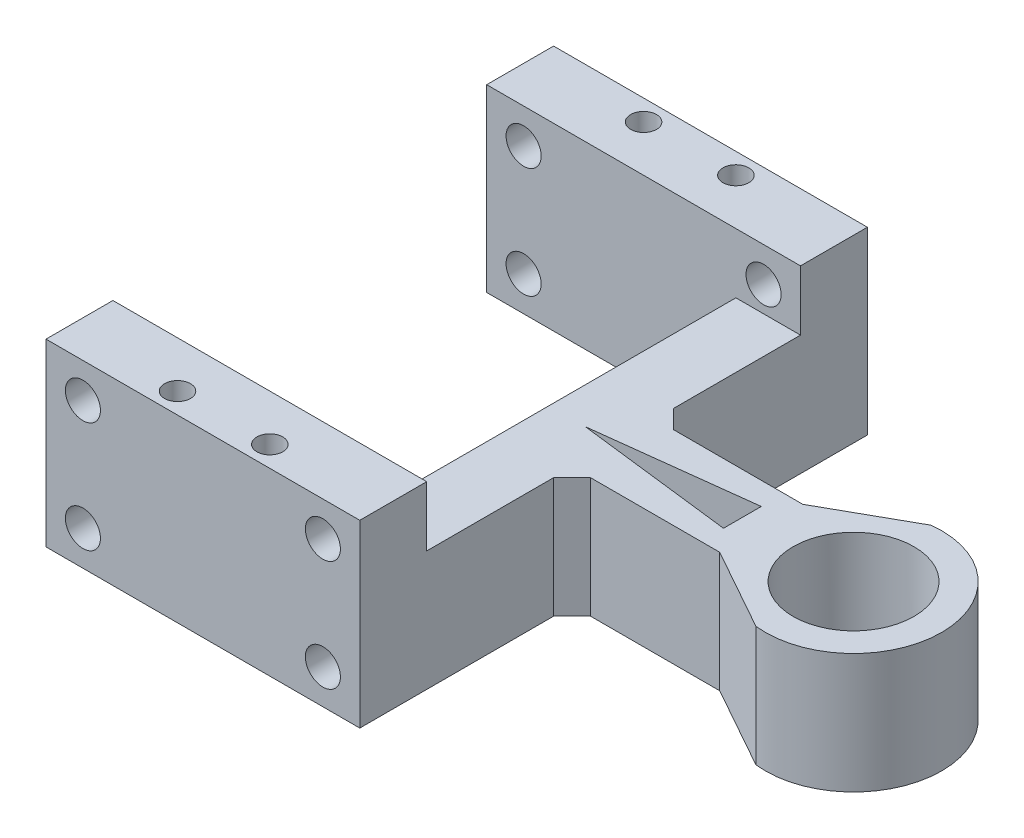
ISO-10303-21;
HEADER;
FILE_DESCRIPTION(('STEP AP214'),'2;1');
FILE_NAME('part.step','',(''),(''),'','','');
FILE_SCHEMA(('AUTOMOTIVE_DESIGN { 1 0 10303 214 1 1 1 1 }'));
ENDSEC;
DATA;
#1=APPLICATION_CONTEXT('core data for automotive mechanical design processes');
#2=APPLICATION_PROTOCOL_DEFINITION('international standard','automotive_design',2000,#1);
#3=PRODUCT_CONTEXT('',#1,'mechanical');
#4=PRODUCT('Part','Part','',(#3));
#5=PRODUCT_RELATED_PRODUCT_CATEGORY('part','',(#4));
#6=PRODUCT_DEFINITION_FORMATION('','',#4);
#7=PRODUCT_DEFINITION_CONTEXT('part definition',#1,'design');
#8=PRODUCT_DEFINITION('design','',#6,#7);
#9=PRODUCT_DEFINITION_SHAPE('','',#8);
#10=(LENGTH_UNIT() NAMED_UNIT(*) SI_UNIT(.MILLI.,.METRE.));
#11=(NAMED_UNIT(*) PLANE_ANGLE_UNIT() SI_UNIT($,.RADIAN.));
#12=(NAMED_UNIT(*) SI_UNIT($,.STERADIAN.) SOLID_ANGLE_UNIT());
#13=UNCERTAINTY_MEASURE_WITH_UNIT(LENGTH_MEASURE(1.E-05),#10,'distance_accuracy_value','');
#14=(GEOMETRIC_REPRESENTATION_CONTEXT(3) GLOBAL_UNCERTAINTY_ASSIGNED_CONTEXT((#13)) GLOBAL_UNIT_ASSIGNED_CONTEXT((#10,
#11,#12)) REPRESENTATION_CONTEXT('',''));
#15=CARTESIAN_POINT('',(0.,0.,0.));
#16=DIRECTION('',(0.,0.,1.));
#17=DIRECTION('',(1.,0.,0.));
#18=AXIS2_PLACEMENT_3D('',#15,#16,#17);
#19=CARTESIAN_POINT('',(0.,0.,0.));
#20=DIRECTION('',(0.,1.,0.));
#21=DIRECTION('',(0.,0.,1.));
#22=AXIS2_PLACEMENT_3D('',#19,#20,#21);
#23=PLANE('',#22);
#24=CARTESIAN_POINT('',(12.,0.,25.25));
#25=DIRECTION('',(0.,1.,0.));
#26=DIRECTION('',(0.,0.,1.));
#27=AXIS2_PLACEMENT_3D('',#24,#25,#26);
#28=CIRCLE('',#27,1.4);
#29=CARTESIAN_POINT('',(12.,0.,26.65));
#30=VERTEX_POINT('',#29);
#31=EDGE_CURVE('E295',#30,#30,#28,.F.);
#32=ORIENTED_EDGE('',*,*,#31,.F.);
#33=EDGE_LOOP('',(#32));
#34=FACE_BOUND('',#33,.T.);
#35=DIRECTION('',(0.872552456288077,0.,0.488520430509967));
#36=VECTOR('',#35,1.);
#37=CARTESIAN_POINT('',(10.0144418941344,0.,-17.8869200290344));
#38=LINE('',#37,#36);
#39=CARTESIAN_POINT('',(50.,0.,4.5));
#40=VERTEX_POINT('',#39);
#41=CARTESIAN_POINT('',(58.9079868315247,0.,9.48736039369625));
#42=VERTEX_POINT('',#41);
#43=EDGE_CURVE('E334',#40,#42,#38,.T.);
#44=ORIENTED_EDGE('',*,*,#43,.F.);
#45=DIRECTION('',(1.,0.,0.));
#46=VECTOR('',#45,1.);
#47=CARTESIAN_POINT('',(0.,0.,4.5));
#48=LINE('',#47,#46);
#49=CARTESIAN_POINT('',(36.,0.,4.5));
#50=VERTEX_POINT('',#49);
#51=EDGE_CURVE('E367',#50,#40,#48,.T.);
#52=ORIENTED_EDGE('',*,*,#51,.F.);
#53=DIRECTION('',(0.707106781186552,0.,-0.707106781186543));
#54=VECTOR('',#53,1.);
#55=CARTESIAN_POINT('',(20.2499999999998,0.,20.25));
#56=LINE('',#55,#54);
#57=CARTESIAN_POINT('',(34.,0.,6.49999999999999));
#58=VERTEX_POINT('',#57);
#59=EDGE_CURVE('E427',#50,#58,#56,.F.);
#60=ORIENTED_EDGE('',*,*,#59,.T.);
#61=DIRECTION('',(0.,0.,-1.));
#62=VECTOR('',#61,1.);
#63=CARTESIAN_POINT('',(34.,0.,0.));
#64=LINE('',#63,#62);
#65=CARTESIAN_POINT('',(34.,0.,27.5));
#66=VERTEX_POINT('',#65);
#67=EDGE_CURVE('E364',#66,#58,#64,.T.);
#68=ORIENTED_EDGE('',*,*,#67,.F.);
#69=DIRECTION('',(1.,0.,0.));
#70=VECTOR('',#69,1.);
#71=CARTESIAN_POINT('',(0.,0.,27.5));
#72=LINE('',#71,#70);
#73=CARTESIAN_POINT('',(0.,0.,27.5));
#74=VERTEX_POINT('',#73);
#75=EDGE_CURVE('E362',#74,#66,#72,.T.);
#76=ORIENTED_EDGE('',*,*,#75,.F.);
#77=DIRECTION('',(0.,0.,1.));
#78=VECTOR('',#77,1.);
#79=CARTESIAN_POINT('',(0.,0.,0.));
#80=LINE('',#79,#78);
#81=CARTESIAN_POINT('',(0.,0.,20.25));
#82=VERTEX_POINT('',#81);
#83=EDGE_CURVE('E360',#82,#74,#80,.T.);
#84=ORIENTED_EDGE('',*,*,#83,.F.);
#85=DIRECTION('',(1.,0.,0.));
#86=VECTOR('',#85,1.);
#87=CARTESIAN_POINT('',(0.,0.,20.25));
#88=LINE('',#87,#86);
#89=CARTESIAN_POINT('',(27.,0.,20.25));
#90=VERTEX_POINT('',#89);
#91=EDGE_CURVE('E357',#82,#90,#88,.T.);
#92=ORIENTED_EDGE('',*,*,#91,.T.);
#93=DIRECTION('',(0.,0.,1.));
#94=VECTOR('',#93,1.);
#95=CARTESIAN_POINT('',(27.,0.,0.));
#96=LINE('',#95,#94);
#97=CARTESIAN_POINT('',(27.,0.,-20.25));
#98=VERTEX_POINT('',#97);
#99=EDGE_CURVE('E354',#98,#90,#96,.T.);
#100=ORIENTED_EDGE('',*,*,#99,.F.);
#101=DIRECTION('',(1.,0.,0.));
#102=VECTOR('',#101,1.);
#103=CARTESIAN_POINT('',(0.,0.,-20.25));
#104=LINE('',#103,#102);
#105=CARTESIAN_POINT('',(0.,0.,-20.25));
#106=VERTEX_POINT('',#105);
#107=EDGE_CURVE('E351',#106,#98,#104,.T.);
#108=ORIENTED_EDGE('',*,*,#107,.F.);
#109=DIRECTION('',(0.,0.,1.));
#110=VECTOR('',#109,1.);
#111=CARTESIAN_POINT('',(0.,0.,0.));
#112=LINE('',#111,#110);
#113=CARTESIAN_POINT('',(0.,0.,-27.5));
#114=VERTEX_POINT('',#113);
#115=EDGE_CURVE('E349',#114,#106,#112,.T.);
#116=ORIENTED_EDGE('',*,*,#115,.F.);
#117=DIRECTION('',(-1.,0.,0.));
#118=VECTOR('',#117,1.);
#119=CARTESIAN_POINT('',(0.,0.,-27.5));
#120=LINE('',#119,#118);
#121=CARTESIAN_POINT('',(34.,0.,-27.5));
#122=VERTEX_POINT('',#121);
#123=EDGE_CURVE('E347',#122,#114,#120,.T.);
#124=ORIENTED_EDGE('',*,*,#123,.F.);
#125=DIRECTION('',(0.,0.,-1.));
#126=VECTOR('',#125,1.);
#127=CARTESIAN_POINT('',(34.,0.,0.));
#128=LINE('',#127,#126);
#129=CARTESIAN_POINT('',(34.,0.,-6.49999999999999));
#130=VERTEX_POINT('',#129);
#131=EDGE_CURVE('E345',#130,#122,#128,.T.);
#132=ORIENTED_EDGE('',*,*,#131,.F.);
#133=DIRECTION('',(0.707106781186545,0.,0.70710678118655));
#134=VECTOR('',#133,1.);
#135=CARTESIAN_POINT('',(20.2500000000001,0.,-20.25));
#136=LINE('',#135,#134);
#137=CARTESIAN_POINT('',(36.,0.,-4.5));
#138=VERTEX_POINT('',#137);
#139=EDGE_CURVE('E50',#130,#138,#136,.T.);
#140=ORIENTED_EDGE('',*,*,#139,.T.);
#141=DIRECTION('',(1.,0.,0.));
#142=VECTOR('',#141,1.);
#143=CARTESIAN_POINT('',(0.,0.,-4.5));
#144=LINE('',#143,#142);
#145=CARTESIAN_POINT('',(50.,0.,-4.5));
#146=VERTEX_POINT('',#145);
#147=EDGE_CURVE('E343',#138,#146,#144,.T.);
#148=ORIENTED_EDGE('',*,*,#147,.T.);
#149=DIRECTION('',(0.872552456288077,0.,-0.488520430509967));
#150=VECTOR('',#149,1.);
#151=CARTESIAN_POINT('',(10.0144418941344,0.,17.8869200290344));
#152=LINE('',#151,#150);
#153=CARTESIAN_POINT('',(58.9079868315247,0.,-9.48736039369625));
#154=VERTEX_POINT('',#153);
#155=EDGE_CURVE('E340',#146,#154,#152,.T.);
#156=ORIENTED_EDGE('',*,*,#155,.T.);
#157=CARTESIAN_POINT('',(60.,0.,0.));
#158=DIRECTION('',(0.,1.,0.));
#159=DIRECTION('',(0.,0.,1.));
#160=AXIS2_PLACEMENT_3D('',#157,#158,#159);
#161=CIRCLE('',#160,9.55);
#162=EDGE_CURVE('E337',#42,#154,#161,.T.);
#163=ORIENTED_EDGE('',*,*,#162,.F.);
#164=EDGE_LOOP('',(#44,#52,#60,#68,#76,#84,#92,#100,#108,#116,#124,#132,#140,#148,#156,#163));
#165=FACE_BOUND('',#164,.T.);
#166=CARTESIAN_POINT('',(60.,0.,0.));
#167=DIRECTION('',(0.,1.,0.));
#168=DIRECTION('',(0.,0.,1.));
#169=AXIS2_PLACEMENT_3D('',#166,#167,#168);
#170=CIRCLE('',#169,4.49999999999996);
#171=CARTESIAN_POINT('',(60.,0.,4.49999999999996));
#172=VERTEX_POINT('',#171);
#173=EDGE_CURVE('E331',#172,#172,#170,.T.);
#174=ORIENTED_EDGE('',*,*,#173,.T.);
#175=EDGE_LOOP('',(#174));
#176=FACE_BOUND('',#175,.T.);
#177=CARTESIAN_POINT('',(22.,0.,-25.25));
#178=DIRECTION('',(0.,1.,0.));
#179=DIRECTION('',(0.,0.,1.));
#180=AXIS2_PLACEMENT_3D('',#177,#178,#179);
#181=CIRCLE('',#180,1.4);
#182=CARTESIAN_POINT('',(22.,0.,-23.85));
#183=VERTEX_POINT('',#182);
#184=EDGE_CURVE('E328',#183,#183,#181,.T.);
#185=ORIENTED_EDGE('',*,*,#184,.T.);
#186=EDGE_LOOP('',(#185));
#187=FACE_BOUND('',#186,.T.);
#188=CARTESIAN_POINT('',(12.,0.,-25.25));
#189=DIRECTION('',(0.,1.,0.));
#190=DIRECTION('',(0.,0.,1.));
#191=AXIS2_PLACEMENT_3D('',#188,#189,#190);
#192=CIRCLE('',#191,1.4);
#193=CARTESIAN_POINT('',(12.,0.,-23.85));
#194=VERTEX_POINT('',#193);
#195=EDGE_CURVE('E325',#194,#194,#192,.T.);
#196=ORIENTED_EDGE('',*,*,#195,.T.);
#197=EDGE_LOOP('',(#196));
#198=FACE_BOUND('',#197,.T.);
#199=CARTESIAN_POINT('',(22.,0.,25.25));
#200=DIRECTION('',(0.,1.,0.));
#201=DIRECTION('',(0.,0.,1.));
#202=AXIS2_PLACEMENT_3D('',#199,#200,#201);
#203=CIRCLE('',#202,1.4);
#204=CARTESIAN_POINT('',(22.,0.,26.65));
#205=VERTEX_POINT('',#204);
#206=EDGE_CURVE('E322',#205,#205,#203,.F.);
#207=ORIENTED_EDGE('',*,*,#206,.F.);
#208=EDGE_LOOP('',(#207));
#209=FACE_BOUND('',#208,.T.);
#210=DIRECTION('',(0.,0.,-1.));
#211=VECTOR('',#210,1.);
#212=CARTESIAN_POINT('',(47.9536863557663,0.,2.04789404059646));
#213=LINE('',#212,#211);
#214=CARTESIAN_POINT('',(47.9536863557663,0.,2.04789404059646));
#215=VERTEX_POINT('',#214);
#216=CARTESIAN_POINT('',(47.9536863557663,0.,-2.04789404059646));
#217=VERTEX_POINT('',#216);
#218=EDGE_CURVE('E201',#215,#217,#213,.T.);
#219=ORIENTED_EDGE('',*,*,#218,.T.);
#220=DIRECTION('',(-0.9928380787496,0.,0.119467775507884));
#221=VECTOR('',#220,1.);
#222=CARTESIAN_POINT('',(47.9536863557663,0.,-2.04789404059646));
#223=LINE('',#222,#221);
#224=CARTESIAN_POINT('',(30.9346435544347,0.,0.));
#225=VERTEX_POINT('',#224);
#226=EDGE_CURVE('E207',#217,#225,#223,.T.);
#227=ORIENTED_EDGE('',*,*,#226,.T.);
#228=DIRECTION('',(0.9928380787496,0.,0.119467775507884));
#229=VECTOR('',#228,1.);
#230=CARTESIAN_POINT('',(30.9346435544347,0.,0.));
#231=LINE('',#230,#229);
#232=EDGE_CURVE('E57',#225,#215,#231,.T.);
#233=ORIENTED_EDGE('',*,*,#232,.T.);
#234=EDGE_LOOP('',(#219,#227,#233));
#235=FACE_BOUND('',#234,.T.);
#236=ADVANCED_FACE('F41',(#34,#165,#176,#187,#198,#209,#235),#23,.F.);
#237=CARTESIAN_POINT('',(30.,3.75,43.));
#238=DIRECTION('',(0.,0.,-1.));
#239=DIRECTION('',(-1.,0.,0.));
#240=AXIS2_PLACEMENT_3D('',#237,#238,#239);
#241=CYLINDRICAL_SURFACE('',#240,1.9);
#242=CARTESIAN_POINT('',(30.,3.75,27.5));
#243=DIRECTION('',(0.,0.,-1.));
#244=DIRECTION('',(-1.,0.,0.));
#245=AXIS2_PLACEMENT_3D('',#242,#243,#244);
#246=CIRCLE('',#245,1.9);
#247=CARTESIAN_POINT('',(28.1,3.75,27.5));
#248=VERTEX_POINT('',#247);
#249=EDGE_CURVE('E283',#248,#248,#246,.F.);
#250=ORIENTED_EDGE('',*,*,#249,.T.);
#251=EDGE_LOOP('',(#250));
#252=FACE_BOUND('',#251,.T.);
#253=CARTESIAN_POINT('',(30.,3.75,-27.5));
#254=DIRECTION('',(0.,0.,1.));
#255=DIRECTION('',(1.,0.,0.));
#256=AXIS2_PLACEMENT_3D('',#253,#254,#255);
#257=CIRCLE('',#256,1.9);
#258=CARTESIAN_POINT('',(31.9,3.75,-27.5));
#259=VERTEX_POINT('',#258);
#260=EDGE_CURVE('E284',#259,#259,#257,.F.);
#261=ORIENTED_EDGE('',*,*,#260,.T.);
#262=EDGE_LOOP('',(#261));
#263=FACE_BOUND('',#262,.T.);
#264=CARTESIAN_POINT('',(30.,3.75,0.112465253631004));
#265=DIRECTION('',(0.119467775507884,0.,0.992838078749601));
#266=DIRECTION('',(0.992838078749601,0.,-0.119467775507884));
#267=AXIS2_PLACEMENT_3D('',#264,#265,#266);
#268=ELLIPSE('',#267,1.91370581030987,1.9);
#269=CARTESIAN_POINT('',(30.9346435544347,2.0957807200514,0.));
#270=VERTEX_POINT('',#269);
#271=CARTESIAN_POINT('',(30.9346435544347,5.40421927994861,0.));
#272=VERTEX_POINT('',#271);
#273=EDGE_CURVE('E216',#270,#272,#268,.T.);
#274=ORIENTED_EDGE('',*,*,#273,.T.);
#275=CARTESIAN_POINT('',(30.,3.75,-0.112465253631011));
#276=DIRECTION('',(0.119467775507884,0.,-0.992838078749601));
#277=DIRECTION('',(-0.992838078749601,0.,-0.119467775507884));
#278=AXIS2_PLACEMENT_3D('',#275,#276,#277);
#279=ELLIPSE('',#278,1.91370581030987,1.9);
#280=EDGE_CURVE('E219',#272,#270,#279,.T.);
#281=ORIENTED_EDGE('',*,*,#280,.T.);
#282=EDGE_LOOP('',(#274,#281));
#283=FACE_BOUND('',#282,.T.);
#284=ADVANCED_FACE('F501',(#252,#263,#283),#241,.F.);
#285=CARTESIAN_POINT('',(23.2141712649288,13.,-67.0395183194468));
#286=DIRECTION('',(0.,-1.,0.));
#287=DIRECTION('',(0.,0.,-1.));
#288=AXIS2_PLACEMENT_3D('',#285,#286,#287);
#289=PLANE('',#288);
#290=DIRECTION('',(-1.,0.,0.));
#291=VECTOR('',#290,1.);
#292=CARTESIAN_POINT('',(23.2141712649288,13.,20.25));
#293=LINE('',#292,#291);
#294=CARTESIAN_POINT('',(34.,13.,20.25));
#295=VERTEX_POINT('',#294);
#296=CARTESIAN_POINT('',(27.,13.,20.25));
#297=VERTEX_POINT('',#296);
#298=EDGE_CURVE('E223',#295,#297,#293,.T.);
#299=ORIENTED_EDGE('',*,*,#298,.F.);
#300=DIRECTION('',(0.,0.,1.));
#301=VECTOR('',#300,1.);
#302=CARTESIAN_POINT('',(34.,13.,0.));
#303=LINE('',#302,#301);
#304=CARTESIAN_POINT('',(34.,13.,6.49999999999999));
#305=VERTEX_POINT('',#304);
#306=EDGE_CURVE('E241',#305,#295,#303,.T.);
#307=ORIENTED_EDGE('',*,*,#306,.F.);
#308=DIRECTION('',(-0.707106781186552,0.,0.707106781186543));
#309=VECTOR('',#308,1.);
#310=CARTESIAN_POINT('',(65.3768447921877,13.,-24.8768447921873));
#311=LINE('',#310,#309);
#312=CARTESIAN_POINT('',(36.,13.,4.5));
#313=VERTEX_POINT('',#312);
#314=EDGE_CURVE('E429',#305,#313,#311,.F.);
#315=ORIENTED_EDGE('',*,*,#314,.T.);
#316=DIRECTION('',(-1.,0.,0.));
#317=VECTOR('',#316,1.);
#318=CARTESIAN_POINT('',(0.,13.,4.5));
#319=LINE('',#318,#317);
#320=CARTESIAN_POINT('',(50.,13.,4.5));
#321=VERTEX_POINT('',#320);
#322=EDGE_CURVE('E238',#321,#313,#319,.T.);
#323=ORIENTED_EDGE('',*,*,#322,.F.);
#324=DIRECTION('',(-0.872552456288077,0.,-0.488520430509967));
#325=VECTOR('',#324,1.);
#326=CARTESIAN_POINT('',(10.0144418941344,13.,-17.8869200290344));
#327=LINE('',#326,#325);
#328=CARTESIAN_POINT('',(58.9079868315247,13.,9.48736039369625));
#329=VERTEX_POINT('',#328);
#330=EDGE_CURVE('E243',#329,#321,#327,.T.);
#331=ORIENTED_EDGE('',*,*,#330,.F.);
#332=CARTESIAN_POINT('',(60.,13.,0.));
#333=DIRECTION('',(0.,-1.,0.));
#334=DIRECTION('',(0.,0.,-1.));
#335=AXIS2_PLACEMENT_3D('',#332,#333,#334);
#336=CIRCLE('',#335,9.55);
#337=CARTESIAN_POINT('',(58.9079868315247,13.,-9.48736039369626));
#338=VERTEX_POINT('',#337);
#339=EDGE_CURVE('E246',#338,#329,#336,.T.);
#340=ORIENTED_EDGE('',*,*,#339,.F.);
#341=DIRECTION('',(-0.872552456288077,0.,0.488520430509967));
#342=VECTOR('',#341,1.);
#343=CARTESIAN_POINT('',(10.0144418941344,13.,17.8869200290344));
#344=LINE('',#343,#342);
#345=CARTESIAN_POINT('',(50.,13.,-4.49999999999999));
#346=VERTEX_POINT('',#345);
#347=EDGE_CURVE('E248',#338,#346,#344,.T.);
#348=ORIENTED_EDGE('',*,*,#347,.T.);
#349=DIRECTION('',(-1.,0.,0.));
#350=VECTOR('',#349,1.);
#351=CARTESIAN_POINT('',(0.,13.,-4.5));
#352=LINE('',#351,#350);
#353=CARTESIAN_POINT('',(36.,13.,-4.5));
#354=VERTEX_POINT('',#353);
#355=EDGE_CURVE('E250',#346,#354,#352,.T.);
#356=ORIENTED_EDGE('',*,*,#355,.T.);
#357=DIRECTION('',(-0.707106781186545,0.,-0.70710678118655));
#358=VECTOR('',#357,1.);
#359=CARTESIAN_POINT('',(-1.66267352725895,13.,-42.1626735272592));
#360=LINE('',#359,#358);
#361=CARTESIAN_POINT('',(34.,13.,-6.49999999999999));
#362=VERTEX_POINT('',#361);
#363=EDGE_CURVE('E12',#354,#362,#360,.T.);
#364=ORIENTED_EDGE('',*,*,#363,.T.);
#365=DIRECTION('',(0.,0.,1.));
#366=VECTOR('',#365,1.);
#367=CARTESIAN_POINT('',(34.,13.,0.));
#368=LINE('',#367,#366);
#369=CARTESIAN_POINT('',(34.,13.,-20.25));
#370=VERTEX_POINT('',#369);
#371=EDGE_CURVE('E253',#370,#362,#368,.T.);
#372=ORIENTED_EDGE('',*,*,#371,.F.);
#373=DIRECTION('',(1.,0.,0.));
#374=VECTOR('',#373,1.);
#375=CARTESIAN_POINT('',(23.2141712649288,13.,-20.25));
#376=LINE('',#375,#374);
#377=CARTESIAN_POINT('',(27.,13.,-20.25));
#378=VERTEX_POINT('',#377);
#379=EDGE_CURVE('E226',#378,#370,#376,.T.);
#380=ORIENTED_EDGE('',*,*,#379,.F.);
#381=DIRECTION('',(0.,0.,-1.));
#382=VECTOR('',#381,1.);
#383=CARTESIAN_POINT('',(27.,13.,0.));
#384=LINE('',#383,#382);
#385=EDGE_CURVE('E256',#297,#378,#384,.T.);
#386=ORIENTED_EDGE('',*,*,#385,.F.);
#387=EDGE_LOOP('',(#299,#307,#315,#323,#331,#340,#348,#356,#364,#372,#380,#386));
#388=FACE_BOUND('',#387,.T.);
#389=CARTESIAN_POINT('',(60.,13.,0.));
#390=DIRECTION('',(0.,-1.,0.));
#391=DIRECTION('',(0.,0.,-1.));
#392=AXIS2_PLACEMENT_3D('',#389,#390,#391);
#393=CIRCLE('',#392,6.55);
#394=CARTESIAN_POINT('',(60.,13.,-6.55));
#395=VERTEX_POINT('',#394);
#396=EDGE_CURVE('E237',#395,#395,#393,.F.);
#397=ORIENTED_EDGE('',*,*,#396,.F.);
#398=EDGE_LOOP('',(#397));
#399=FACE_BOUND('',#398,.T.);
#400=DIRECTION('',(0.,0.,1.));
#401=VECTOR('',#400,1.);
#402=CARTESIAN_POINT('',(47.9536863557663,13.,2.04789404059646));
#403=LINE('',#402,#401);
#404=CARTESIAN_POINT('',(47.9536863557663,13.,-2.04789404059647));
#405=VERTEX_POINT('',#404);
#406=CARTESIAN_POINT('',(47.9536863557663,13.,2.04789404059646));
#407=VERTEX_POINT('',#406);
#408=EDGE_CURVE('E214',#405,#407,#403,.T.);
#409=ORIENTED_EDGE('',*,*,#408,.T.);
#410=DIRECTION('',(-0.992838078749601,0.,-0.119467775507884));
#411=VECTOR('',#410,1.);
#412=CARTESIAN_POINT('',(30.9346435544347,13.,0.));
#413=LINE('',#412,#411);
#414=CARTESIAN_POINT('',(30.9346435544347,13.,0.));
#415=VERTEX_POINT('',#414);
#416=EDGE_CURVE('E193',#407,#415,#413,.T.);
#417=ORIENTED_EDGE('',*,*,#416,.T.);
#418=DIRECTION('',(0.992838078749601,0.,-0.119467775507884));
#419=VECTOR('',#418,1.);
#420=CARTESIAN_POINT('',(47.9536863557663,13.,-2.04789404059646));
#421=LINE('',#420,#419);
#422=EDGE_CURVE('E220',#415,#405,#421,.T.);
#423=ORIENTED_EDGE('',*,*,#422,.T.);
#424=EDGE_LOOP('',(#409,#417,#423));
#425=FACE_BOUND('',#424,.T.);
#426=ADVANCED_FACE('F447',(#388,#399,#425),#289,.F.);
#427=CARTESIAN_POINT('',(0.,19.5,0.));
#428=DIRECTION('',(0.,1.,0.));
#429=DIRECTION('',(0.,0.,1.));
#430=AXIS2_PLACEMENT_3D('',#427,#428,#429);
#431=PLANE('',#430);
#432=CARTESIAN_POINT('',(12.,19.5,25.25));
#433=DIRECTION('',(0.,1.,0.));
#434=DIRECTION('',(0.,0.,1.));
#435=AXIS2_PLACEMENT_3D('',#432,#433,#434);
#436=CIRCLE('',#435,1.4);
#437=CARTESIAN_POINT('',(12.,19.5,26.65));
#438=VERTEX_POINT('',#437);
#439=EDGE_CURVE('E318',#438,#438,#436,.F.);
#440=ORIENTED_EDGE('',*,*,#439,.T.);
#441=EDGE_LOOP('',(#440));
#442=FACE_BOUND('',#441,.T.);
#443=CARTESIAN_POINT('',(22.,19.5,25.25));
#444=DIRECTION('',(0.,1.,0.));
#445=DIRECTION('',(0.,0.,1.));
#446=AXIS2_PLACEMENT_3D('',#443,#444,#445);
#447=CIRCLE('',#446,1.4);
#448=CARTESIAN_POINT('',(22.,19.5,26.65));
#449=VERTEX_POINT('',#448);
#450=EDGE_CURVE('E291',#449,#449,#447,.F.);
#451=ORIENTED_EDGE('',*,*,#450,.T.);
#452=EDGE_LOOP('',(#451));
#453=FACE_BOUND('',#452,.T.);
#454=DIRECTION('',(0.,0.,-1.));
#455=VECTOR('',#454,1.);
#456=CARTESIAN_POINT('',(34.,19.5,0.));
#457=LINE('',#456,#455);
#458=CARTESIAN_POINT('',(34.,19.5,27.5));
#459=VERTEX_POINT('',#458);
#460=CARTESIAN_POINT('',(34.,19.5,20.25));
#461=VERTEX_POINT('',#460);
#462=EDGE_CURVE('E315',#459,#461,#457,.T.);
#463=ORIENTED_EDGE('',*,*,#462,.T.);
#464=DIRECTION('',(1.,0.,0.));
#465=VECTOR('',#464,1.);
#466=CARTESIAN_POINT('',(0.,19.5,20.25));
#467=LINE('',#466,#465);
#468=CARTESIAN_POINT('',(0.,19.5,20.25));
#469=VERTEX_POINT('',#468);
#470=EDGE_CURVE('E309',#469,#461,#467,.T.);
#471=ORIENTED_EDGE('',*,*,#470,.F.);
#472=DIRECTION('',(0.,0.,1.));
#473=VECTOR('',#472,1.);
#474=CARTESIAN_POINT('',(0.,19.5,0.));
#475=LINE('',#474,#473);
#476=CARTESIAN_POINT('',(0.,19.5,27.5));
#477=VERTEX_POINT('',#476);
#478=EDGE_CURVE('E311',#469,#477,#475,.T.);
#479=ORIENTED_EDGE('',*,*,#478,.T.);
#480=DIRECTION('',(1.,0.,0.));
#481=VECTOR('',#480,1.);
#482=CARTESIAN_POINT('',(0.,19.5,27.5));
#483=LINE('',#482,#481);
#484=EDGE_CURVE('E313',#477,#459,#483,.T.);
#485=ORIENTED_EDGE('',*,*,#484,.T.);
#486=EDGE_LOOP('',(#463,#471,#479,#485));
#487=FACE_BOUND('',#486,.T.);
#488=ADVANCED_FACE('F633',(#442,#453,#487),#431,.T.);
#489=CARTESIAN_POINT('',(30.,15.75,43.));
#490=DIRECTION('',(0.,0.,-1.));
#491=DIRECTION('',(-1.,0.,0.));
#492=AXIS2_PLACEMENT_3D('',#489,#490,#491);
#493=CYLINDRICAL_SURFACE('',#492,1.9);
#494=CARTESIAN_POINT('',(30.,15.75,27.5));
#495=DIRECTION('',(0.,0.,-1.));
#496=DIRECTION('',(-1.,0.,0.));
#497=AXIS2_PLACEMENT_3D('',#494,#495,#496);
#498=CIRCLE('',#497,1.9);
#499=CARTESIAN_POINT('',(28.1,15.75,27.5));
#500=VERTEX_POINT('',#499);
#501=EDGE_CURVE('E259',#500,#500,#498,.F.);
#502=ORIENTED_EDGE('',*,*,#501,.T.);
#503=EDGE_LOOP('',(#502));
#504=FACE_BOUND('',#503,.T.);
#505=CARTESIAN_POINT('',(30.,15.75,20.25));
#506=DIRECTION('',(0.,0.,-1.));
#507=DIRECTION('',(-1.,0.,0.));
#508=AXIS2_PLACEMENT_3D('',#505,#506,#507);
#509=CIRCLE('',#508,1.9);
#510=CARTESIAN_POINT('',(28.1,15.75,20.25));
#511=VERTEX_POINT('',#510);
#512=EDGE_CURVE('E229',#511,#511,#509,.T.);
#513=ORIENTED_EDGE('',*,*,#512,.T.);
#514=EDGE_LOOP('',(#513));
#515=FACE_BOUND('',#514,.T.);
#516=ADVANCED_FACE('F655',(#504,#515),#493,.F.);
#517=CARTESIAN_POINT('',(60.,19.5,0.));
#518=DIRECTION('',(0.,-1.,0.));
#519=DIRECTION('',(0.,0.,-1.));
#520=AXIS2_PLACEMENT_3D('',#517,#518,#519);
#521=CYLINDRICAL_SURFACE('',#520,4.49999999999996);
#522=ORIENTED_EDGE('',*,*,#173,.F.);
#523=EDGE_LOOP('',(#522));
#524=FACE_BOUND('',#523,.T.);
#525=CARTESIAN_POINT('',(60.,3.,0.));
#526=DIRECTION('',(0.,1.,0.));
#527=DIRECTION('',(0.,0.,1.));
#528=AXIS2_PLACEMENT_3D('',#525,#526,#527);
#529=CIRCLE('',#528,4.49999999999996);
#530=CARTESIAN_POINT('',(60.,3.,4.49999999999996));
#531=VERTEX_POINT('',#530);
#532=EDGE_CURVE('E290',#531,#531,#529,.T.);
#533=ORIENTED_EDGE('',*,*,#532,.T.);
#534=EDGE_LOOP('',(#533));
#535=FACE_BOUND('',#534,.T.);
#536=ADVANCED_FACE('F498',(#524,#535),#521,.F.);
#537=CARTESIAN_POINT('',(10.0144418941344,19.5,-17.8869200290344));
#538=DIRECTION('',(0.488520430509967,0.,-0.872552456288077));
#539=DIRECTION('',(-0.872552456288077,0.,-0.488520430509967));
#540=AXIS2_PLACEMENT_3D('',#537,#538,#539);
#541=PLANE('',#540);
#542=DIRECTION('',(0.,-1.,0.));
#543=VECTOR('',#542,1.);
#544=CARTESIAN_POINT('',(58.9079868315247,19.5,9.48736039369625));
#545=LINE('',#544,#543);
#546=EDGE_CURVE('E399',#329,#42,#545,.T.);
#547=ORIENTED_EDGE('',*,*,#546,.F.);
#548=ORIENTED_EDGE('',*,*,#330,.T.);
#549=DIRECTION('',(0.,-1.,0.));
#550=VECTOR('',#549,1.);
#551=CARTESIAN_POINT('',(50.,19.5,4.5));
#552=LINE('',#551,#550);
#553=EDGE_CURVE('E321',#321,#40,#552,.T.);
#554=ORIENTED_EDGE('',*,*,#553,.T.);
#555=ORIENTED_EDGE('',*,*,#43,.T.);
#556=EDGE_LOOP('',(#547,#548,#554,#555));
#557=FACE_BOUND('',#556,.T.);
#558=ADVANCED_FACE('F483',(#557),#541,.F.);
#559=CARTESIAN_POINT('',(60.,19.5,0.));
#560=DIRECTION('',(0.,-1.,0.));
#561=DIRECTION('',(0.,0.,-1.));
#562=AXIS2_PLACEMENT_3D('',#559,#560,#561);
#563=CYLINDRICAL_SURFACE('',#562,9.55);
#564=ORIENTED_EDGE('',*,*,#339,.T.);
#565=ORIENTED_EDGE('',*,*,#546,.T.);
#566=ORIENTED_EDGE('',*,*,#162,.T.);
#567=DIRECTION('',(0.,-1.,0.));
#568=VECTOR('',#567,1.);
#569=CARTESIAN_POINT('',(58.9079868315247,19.5,-9.48736039369625));
#570=LINE('',#569,#568);
#571=EDGE_CURVE('E397',#338,#154,#570,.T.);
#572=ORIENTED_EDGE('',*,*,#571,.F.);
#573=EDGE_LOOP('',(#564,#565,#566,#572));
#574=FACE_BOUND('',#573,.T.);
#575=ADVANCED_FACE('F490',(#574),#563,.T.);
#576=CARTESIAN_POINT('',(10.0144418941344,19.5,17.8869200290344));
#577=DIRECTION('',(-0.488520430509967,0.,-0.872552456288077));
#578=DIRECTION('',(-0.872552456288077,0.,0.488520430509967));
#579=AXIS2_PLACEMENT_3D('',#576,#577,#578);
#580=PLANE('',#579);
#581=ORIENTED_EDGE('',*,*,#347,.F.);
#582=ORIENTED_EDGE('',*,*,#571,.T.);
#583=ORIENTED_EDGE('',*,*,#155,.F.);
#584=DIRECTION('',(0.,-1.,0.));
#585=VECTOR('',#584,1.);
#586=CARTESIAN_POINT('',(50.,19.5,-4.5));
#587=LINE('',#586,#585);
#588=EDGE_CURVE('E394',#346,#146,#587,.T.);
#589=ORIENTED_EDGE('',*,*,#588,.F.);
#590=EDGE_LOOP('',(#581,#582,#583,#589));
#591=FACE_BOUND('',#590,.T.);
#592=ADVANCED_FACE('F489',(#591),#580,.T.);
#593=CARTESIAN_POINT('',(0.,19.5,-4.5));
#594=DIRECTION('',(0.,0.,-1.));
#595=DIRECTION('',(-1.,0.,0.));
#596=AXIS2_PLACEMENT_3D('',#593,#594,#595);
#597=PLANE('',#596);
#598=ORIENTED_EDGE('',*,*,#147,.F.);
#599=DIRECTION('',(0.,1.,0.));
#600=VECTOR('',#599,1.);
#601=CARTESIAN_POINT('',(36.,19.5,-4.5));
#602=LINE('',#601,#600);
#603=EDGE_CURVE('E425',#138,#354,#602,.T.);
#604=ORIENTED_EDGE('',*,*,#603,.T.);
#605=ORIENTED_EDGE('',*,*,#355,.F.);
#606=ORIENTED_EDGE('',*,*,#588,.T.);
#607=EDGE_LOOP('',(#598,#604,#605,#606));
#608=FACE_BOUND('',#607,.T.);
#609=ADVANCED_FACE('F440',(#608),#597,.T.);
#610=CARTESIAN_POINT('',(34.,19.5,0.));
#611=DIRECTION('',(-1.,0.,0.));
#612=DIRECTION('',(0.,0.,1.));
#613=AXIS2_PLACEMENT_3D('',#610,#611,#612);
#614=PLANE('',#613);
#615=ORIENTED_EDGE('',*,*,#371,.T.);
#616=DIRECTION('',(0.,-1.,0.));
#617=VECTOR('',#616,1.);
#618=CARTESIAN_POINT('',(34.,19.5,-6.49999999999999));
#619=LINE('',#618,#617);
#620=EDGE_CURVE('E422',#362,#130,#619,.T.);
#621=ORIENTED_EDGE('',*,*,#620,.T.);
#622=ORIENTED_EDGE('',*,*,#131,.T.);
#623=DIRECTION('',(0.,-1.,0.));
#624=VECTOR('',#623,1.);
#625=CARTESIAN_POINT('',(34.,19.5,-27.5));
#626=LINE('',#625,#624);
#627=CARTESIAN_POINT('',(34.,19.5,-27.5));
#628=VERTEX_POINT('',#627);
#629=EDGE_CURVE('E391',#628,#122,#626,.T.);
#630=ORIENTED_EDGE('',*,*,#629,.F.);
#631=DIRECTION('',(0.,0.,-1.));
#632=VECTOR('',#631,1.);
#633=CARTESIAN_POINT('',(34.,19.5,0.));
#634=LINE('',#633,#632);
#635=CARTESIAN_POINT('',(34.,19.5,-20.25));
#636=VERTEX_POINT('',#635);
#637=EDGE_CURVE('E301',#636,#628,#634,.T.);
#638=ORIENTED_EDGE('',*,*,#637,.F.);
#639=DIRECTION('',(0.,-1.,0.));
#640=VECTOR('',#639,1.);
#641=CARTESIAN_POINT('',(34.,19.5,-20.25));
#642=LINE('',#641,#640);
#643=EDGE_CURVE('E234',#636,#370,#642,.T.);
#644=ORIENTED_EDGE('',*,*,#643,.T.);
#645=EDGE_LOOP('',(#615,#621,#622,#630,#638,#644));
#646=FACE_BOUND('',#645,.T.);
#647=ADVANCED_FACE('F450',(#646),#614,.F.);
#648=CARTESIAN_POINT('',(0.,19.5,-27.5));
#649=DIRECTION('',(0.,0.,1.));
#650=DIRECTION('',(1.,0.,0.));
#651=AXIS2_PLACEMENT_3D('',#648,#649,#650);
#652=PLANE('',#651);
#653=ORIENTED_EDGE('',*,*,#260,.F.);
#654=EDGE_LOOP('',(#653));
#655=FACE_BOUND('',#654,.T.);
#656=CARTESIAN_POINT('',(4.,15.75,-27.5));
#657=DIRECTION('',(0.,0.,1.));
#658=DIRECTION('',(1.,0.,0.));
#659=AXIS2_PLACEMENT_3D('',#656,#657,#658);
#660=CIRCLE('',#659,1.9);
#661=CARTESIAN_POINT('',(5.9,15.75,-27.5));
#662=VERTEX_POINT('',#661);
#663=EDGE_CURVE('E280',#662,#662,#660,.F.);
#664=ORIENTED_EDGE('',*,*,#663,.F.);
#665=EDGE_LOOP('',(#664));
#666=FACE_BOUND('',#665,.T.);
#667=CARTESIAN_POINT('',(4.,3.75,-27.5));
#668=DIRECTION('',(0.,0.,1.));
#669=DIRECTION('',(1.,0.,0.));
#670=AXIS2_PLACEMENT_3D('',#667,#668,#669);
#671=CIRCLE('',#670,1.9);
#672=CARTESIAN_POINT('',(5.9,3.75,-27.5));
#673=VERTEX_POINT('',#672);
#674=EDGE_CURVE('E270',#673,#673,#671,.F.);
#675=ORIENTED_EDGE('',*,*,#674,.F.);
#676=EDGE_LOOP('',(#675));
#677=FACE_BOUND('',#676,.T.);
#678=CARTESIAN_POINT('',(30.,15.75,-27.5));
#679=DIRECTION('',(0.,0.,1.));
#680=DIRECTION('',(1.,0.,0.));
#681=AXIS2_PLACEMENT_3D('',#678,#679,#680);
#682=CIRCLE('',#681,1.9);
#683=CARTESIAN_POINT('',(31.9,15.75,-27.5));
#684=VERTEX_POINT('',#683);
#685=EDGE_CURVE('E260',#684,#684,#682,.F.);
#686=ORIENTED_EDGE('',*,*,#685,.F.);
#687=EDGE_LOOP('',(#686));
#688=FACE_BOUND('',#687,.T.);
#689=ORIENTED_EDGE('',*,*,#123,.T.);
#690=DIRECTION('',(0.,-1.,0.));
#691=VECTOR('',#690,1.);
#692=CARTESIAN_POINT('',(0.,19.5,-27.5));
#693=LINE('',#692,#691);
#694=CARTESIAN_POINT('',(0.,19.5,-27.5));
#695=VERTEX_POINT('',#694);
#696=EDGE_CURVE('E388',#695,#114,#693,.T.);
#697=ORIENTED_EDGE('',*,*,#696,.F.);
#698=DIRECTION('',(-1.,0.,0.));
#699=VECTOR('',#698,1.);
#700=CARTESIAN_POINT('',(0.,19.5,-27.5));
#701=LINE('',#700,#699);
#702=EDGE_CURVE('E303',#628,#695,#701,.T.);
#703=ORIENTED_EDGE('',*,*,#702,.F.);
#704=ORIENTED_EDGE('',*,*,#629,.T.);
#705=EDGE_LOOP('',(#689,#697,#703,#704));
#706=FACE_BOUND('',#705,.T.);
#707=ADVANCED_FACE('F542',(#655,#666,#677,#688,#706),#652,.F.);
#708=CARTESIAN_POINT('',(0.,19.5,0.));
#709=DIRECTION('',(1.,0.,0.));
#710=DIRECTION('',(0.,0.,-1.));
#711=AXIS2_PLACEMENT_3D('',#708,#709,#710);
#712=PLANE('',#711);
#713=ORIENTED_EDGE('',*,*,#115,.T.);
#714=DIRECTION('',(0.,-1.,0.));
#715=VECTOR('',#714,1.);
#716=CARTESIAN_POINT('',(0.,19.5,-20.25));
#717=LINE('',#716,#715);
#718=CARTESIAN_POINT('',(0.,19.5,-20.25));
#719=VERTEX_POINT('',#718);
#720=EDGE_CURVE('E385',#719,#106,#717,.T.);
#721=ORIENTED_EDGE('',*,*,#720,.F.);
#722=DIRECTION('',(0.,0.,1.));
#723=VECTOR('',#722,1.);
#724=CARTESIAN_POINT('',(0.,19.5,0.));
#725=LINE('',#724,#723);
#726=EDGE_CURVE('E305',#695,#719,#725,.T.);
#727=ORIENTED_EDGE('',*,*,#726,.F.);
#728=ORIENTED_EDGE('',*,*,#696,.T.);
#729=EDGE_LOOP('',(#713,#721,#727,#728));
#730=FACE_BOUND('',#729,.T.);
#731=ADVANCED_FACE('F539',(#730),#712,.F.);
#732=CARTESIAN_POINT('',(0.,19.5,-20.25));
#733=DIRECTION('',(0.,0.,-1.));
#734=DIRECTION('',(-1.,0.,0.));
#735=AXIS2_PLACEMENT_3D('',#732,#733,#734);
#736=PLANE('',#735);
#737=ORIENTED_EDGE('',*,*,#643,.F.);
#738=DIRECTION('',(1.,0.,0.));
#739=VECTOR('',#738,1.);
#740=CARTESIAN_POINT('',(0.,19.5,-20.25));
#741=LINE('',#740,#739);
#742=EDGE_CURVE('E307',#719,#636,#741,.T.);
#743=ORIENTED_EDGE('',*,*,#742,.F.);
#744=ORIENTED_EDGE('',*,*,#720,.T.);
#745=ORIENTED_EDGE('',*,*,#107,.T.);
#746=DIRECTION('',(0.,-1.,0.));
#747=VECTOR('',#746,1.);
#748=CARTESIAN_POINT('',(27.,19.5,-20.25));
#749=LINE('',#748,#747);
#750=EDGE_CURVE('E383',#378,#98,#749,.T.);
#751=ORIENTED_EDGE('',*,*,#750,.F.);
#752=ORIENTED_EDGE('',*,*,#379,.T.);
#753=EDGE_LOOP('',(#737,#743,#744,#745,#751,#752));
#754=FACE_BOUND('',#753,.T.);
#755=CARTESIAN_POINT('',(4.,15.75,-20.25));
#756=DIRECTION('',(0.,0.,-1.));
#757=DIRECTION('',(-1.,0.,0.));
#758=AXIS2_PLACEMENT_3D('',#755,#756,#757);
#759=CIRCLE('',#758,1.9);
#760=CARTESIAN_POINT('',(2.1,15.75,-20.25));
#761=VERTEX_POINT('',#760);
#762=EDGE_CURVE('E277',#761,#761,#759,.F.);
#763=ORIENTED_EDGE('',*,*,#762,.F.);
#764=EDGE_LOOP('',(#763));
#765=FACE_BOUND('',#764,.T.);
#766=CARTESIAN_POINT('',(4.,3.75,-20.25));
#767=DIRECTION('',(0.,0.,-1.));
#768=DIRECTION('',(-1.,0.,0.));
#769=AXIS2_PLACEMENT_3D('',#766,#767,#768);
#770=CIRCLE('',#769,1.9);
#771=CARTESIAN_POINT('',(2.1,3.75,-20.25));
#772=VERTEX_POINT('',#771);
#773=EDGE_CURVE('E267',#772,#772,#770,.F.);
#774=ORIENTED_EDGE('',*,*,#773,.F.);
#775=EDGE_LOOP('',(#774));
#776=FACE_BOUND('',#775,.T.);
#777=CARTESIAN_POINT('',(30.,15.75,-20.25));
#778=DIRECTION('',(0.,0.,-1.));
#779=DIRECTION('',(-1.,0.,0.));
#780=AXIS2_PLACEMENT_3D('',#777,#778,#779);
#781=CIRCLE('',#780,1.9);
#782=CARTESIAN_POINT('',(28.1,15.75,-20.25));
#783=VERTEX_POINT('',#782);
#784=EDGE_CURVE('E233',#783,#783,#781,.T.);
#785=ORIENTED_EDGE('',*,*,#784,.T.);
#786=EDGE_LOOP('',(#785));
#787=FACE_BOUND('',#786,.T.);
#788=ADVANCED_FACE('F456',(#754,#765,#776,#787),#736,.F.);
#789=CARTESIAN_POINT('',(27.,19.5,0.));
#790=DIRECTION('',(1.,0.,0.));
#791=DIRECTION('',(0.,0.,-1.));
#792=AXIS2_PLACEMENT_3D('',#789,#790,#791);
#793=PLANE('',#792);
#794=DIRECTION('',(0.,-1.,0.));
#795=VECTOR('',#794,1.);
#796=CARTESIAN_POINT('',(27.,19.5,20.25));
#797=LINE('',#796,#795);
#798=EDGE_CURVE('E381',#297,#90,#797,.T.);
#799=ORIENTED_EDGE('',*,*,#798,.F.);
#800=ORIENTED_EDGE('',*,*,#385,.T.);
#801=ORIENTED_EDGE('',*,*,#750,.T.);
#802=ORIENTED_EDGE('',*,*,#99,.T.);
#803=EDGE_LOOP('',(#799,#800,#801,#802));
#804=FACE_BOUND('',#803,.T.);
#805=ADVANCED_FACE('F461',(#804),#793,.F.);
#806=CARTESIAN_POINT('',(0.,19.5,20.25));
#807=DIRECTION('',(0.,0.,-1.));
#808=DIRECTION('',(-1.,0.,0.));
#809=AXIS2_PLACEMENT_3D('',#806,#807,#808);
#810=PLANE('',#809);
#811=ORIENTED_EDGE('',*,*,#470,.T.);
#812=DIRECTION('',(0.,-1.,0.));
#813=VECTOR('',#812,1.);
#814=CARTESIAN_POINT('',(34.,19.5,20.25));
#815=LINE('',#814,#813);
#816=EDGE_CURVE('E230',#461,#295,#815,.T.);
#817=ORIENTED_EDGE('',*,*,#816,.T.);
#818=ORIENTED_EDGE('',*,*,#298,.T.);
#819=ORIENTED_EDGE('',*,*,#798,.T.);
#820=ORIENTED_EDGE('',*,*,#91,.F.);
#821=DIRECTION('',(0.,-1.,0.));
#822=VECTOR('',#821,1.);
#823=CARTESIAN_POINT('',(0.,19.5,20.25));
#824=LINE('',#823,#822);
#825=EDGE_CURVE('E379',#469,#82,#824,.T.);
#826=ORIENTED_EDGE('',*,*,#825,.F.);
#827=EDGE_LOOP('',(#811,#817,#818,#819,#820,#826));
#828=FACE_BOUND('',#827,.T.);
#829=CARTESIAN_POINT('',(4.,15.75,20.25));
#830=DIRECTION('',(0.,0.,-1.));
#831=DIRECTION('',(-1.,0.,0.));
#832=AXIS2_PLACEMENT_3D('',#829,#830,#831);
#833=CIRCLE('',#832,1.9);
#834=CARTESIAN_POINT('',(2.1,15.75,20.25));
#835=VERTEX_POINT('',#834);
#836=EDGE_CURVE('E274',#835,#835,#833,.F.);
#837=ORIENTED_EDGE('',*,*,#836,.T.);
#838=EDGE_LOOP('',(#837));
#839=FACE_BOUND('',#838,.T.);
#840=CARTESIAN_POINT('',(4.,3.75,20.25));
#841=DIRECTION('',(0.,0.,-1.));
#842=DIRECTION('',(-1.,0.,0.));
#843=AXIS2_PLACEMENT_3D('',#840,#841,#842);
#844=CIRCLE('',#843,1.9);
#845=CARTESIAN_POINT('',(2.1,3.75,20.25));
#846=VERTEX_POINT('',#845);
#847=EDGE_CURVE('E264',#846,#846,#844,.F.);
#848=ORIENTED_EDGE('',*,*,#847,.T.);
#849=EDGE_LOOP('',(#848));
#850=FACE_BOUND('',#849,.T.);
#851=ORIENTED_EDGE('',*,*,#512,.F.);
#852=EDGE_LOOP('',(#851));
#853=FACE_BOUND('',#852,.T.);
#854=ADVANCED_FACE('F465',(#828,#839,#850,#853),#810,.T.);
#855=CARTESIAN_POINT('',(0.,19.5,0.));
#856=DIRECTION('',(1.,0.,0.));
#857=DIRECTION('',(0.,0.,-1.));
#858=AXIS2_PLACEMENT_3D('',#855,#856,#857);
#859=PLANE('',#858);
#860=ORIENTED_EDGE('',*,*,#83,.T.);
#861=DIRECTION('',(0.,-1.,0.));
#862=VECTOR('',#861,1.);
#863=CARTESIAN_POINT('',(0.,19.5,27.5));
#864=LINE('',#863,#862);
#865=EDGE_CURVE('E376',#477,#74,#864,.T.);
#866=ORIENTED_EDGE('',*,*,#865,.F.);
#867=ORIENTED_EDGE('',*,*,#478,.F.);
#868=ORIENTED_EDGE('',*,*,#825,.T.);
#869=EDGE_LOOP('',(#860,#866,#867,#868));
#870=FACE_BOUND('',#869,.T.);
#871=ADVANCED_FACE('F528',(#870),#859,.F.);
#872=CARTESIAN_POINT('',(0.,19.5,27.5));
#873=DIRECTION('',(0.,0.,-1.));
#874=DIRECTION('',(-1.,0.,0.));
#875=AXIS2_PLACEMENT_3D('',#872,#873,#874);
#876=PLANE('',#875);
#877=ORIENTED_EDGE('',*,*,#249,.F.);
#878=EDGE_LOOP('',(#877));
#879=FACE_BOUND('',#878,.T.);
#880=CARTESIAN_POINT('',(4.,15.75,27.5));
#881=DIRECTION('',(0.,0.,-1.));
#882=DIRECTION('',(-1.,0.,0.));
#883=AXIS2_PLACEMENT_3D('',#880,#881,#882);
#884=CIRCLE('',#883,1.9);
#885=CARTESIAN_POINT('',(2.1,15.75,27.5));
#886=VERTEX_POINT('',#885);
#887=EDGE_CURVE('E273',#886,#886,#884,.F.);
#888=ORIENTED_EDGE('',*,*,#887,.F.);
#889=EDGE_LOOP('',(#888));
#890=FACE_BOUND('',#889,.T.);
#891=CARTESIAN_POINT('',(4.,3.75,27.5));
#892=DIRECTION('',(0.,0.,-1.));
#893=DIRECTION('',(-1.,0.,0.));
#894=AXIS2_PLACEMENT_3D('',#891,#892,#893);
#895=CIRCLE('',#894,1.9);
#896=CARTESIAN_POINT('',(2.1,3.75,27.5));
#897=VERTEX_POINT('',#896);
#898=EDGE_CURVE('E263',#897,#897,#895,.F.);
#899=ORIENTED_EDGE('',*,*,#898,.F.);
#900=EDGE_LOOP('',(#899));
#901=FACE_BOUND('',#900,.T.);
#902=ORIENTED_EDGE('',*,*,#501,.F.);
#903=EDGE_LOOP('',(#902));
#904=FACE_BOUND('',#903,.T.);
#905=ORIENTED_EDGE('',*,*,#75,.T.);
#906=DIRECTION('',(0.,-1.,0.));
#907=VECTOR('',#906,1.);
#908=CARTESIAN_POINT('',(34.,19.5,27.5));
#909=LINE('',#908,#907);
#910=EDGE_CURVE('E373',#459,#66,#909,.T.);
#911=ORIENTED_EDGE('',*,*,#910,.F.);
#912=ORIENTED_EDGE('',*,*,#484,.F.);
#913=ORIENTED_EDGE('',*,*,#865,.T.);
#914=EDGE_LOOP('',(#905,#911,#912,#913));
#915=FACE_BOUND('',#914,.T.);
#916=ADVANCED_FACE('F525',(#879,#890,#901,#904,#915),#876,.F.);
#917=CARTESIAN_POINT('',(34.,19.5,0.));
#918=DIRECTION('',(-1.,0.,0.));
#919=DIRECTION('',(0.,0.,1.));
#920=AXIS2_PLACEMENT_3D('',#917,#918,#919);
#921=PLANE('',#920);
#922=ORIENTED_EDGE('',*,*,#67,.T.);
#923=DIRECTION('',(0.,1.,0.));
#924=VECTOR('',#923,1.);
#925=CARTESIAN_POINT('',(34.,13.,6.49999999999999));
#926=LINE('',#925,#924);
#927=EDGE_CURVE('E420',#58,#305,#926,.T.);
#928=ORIENTED_EDGE('',*,*,#927,.T.);
#929=ORIENTED_EDGE('',*,*,#306,.T.);
#930=ORIENTED_EDGE('',*,*,#816,.F.);
#931=ORIENTED_EDGE('',*,*,#462,.F.);
#932=ORIENTED_EDGE('',*,*,#910,.T.);
#933=EDGE_LOOP('',(#922,#928,#929,#930,#931,#932));
#934=FACE_BOUND('',#933,.T.);
#935=ADVANCED_FACE('F522',(#934),#921,.F.);
#936=CARTESIAN_POINT('',(0.,19.5,4.5));
#937=DIRECTION('',(0.,0.,-1.));
#938=DIRECTION('',(-1.,0.,0.));
#939=AXIS2_PLACEMENT_3D('',#936,#937,#938);
#940=PLANE('',#939);
#941=ORIENTED_EDGE('',*,*,#322,.T.);
#942=DIRECTION('',(0.,-1.,0.));
#943=VECTOR('',#942,1.);
#944=CARTESIAN_POINT('',(36.,0.,4.5));
#945=LINE('',#944,#943);
#946=EDGE_CURVE('E401',#313,#50,#945,.T.);
#947=ORIENTED_EDGE('',*,*,#946,.T.);
#948=ORIENTED_EDGE('',*,*,#51,.T.);
#949=ORIENTED_EDGE('',*,*,#553,.F.);
#950=EDGE_LOOP('',(#941,#947,#948,#949));
#951=FACE_BOUND('',#950,.T.);
#952=ADVANCED_FACE('F477',(#951),#940,.F.);
#953=CARTESIAN_POINT('',(22.,19.5,-25.25));
#954=DIRECTION('',(0.,-1.,0.));
#955=DIRECTION('',(0.,0.,-1.));
#956=AXIS2_PLACEMENT_3D('',#953,#954,#955);
#957=CYLINDRICAL_SURFACE('',#956,1.4);
#958=CARTESIAN_POINT('',(22.,19.5,-25.25));
#959=DIRECTION('',(0.,1.,0.));
#960=DIRECTION('',(0.,0.,1.));
#961=AXIS2_PLACEMENT_3D('',#958,#959,#960);
#962=CIRCLE('',#961,1.4);
#963=CARTESIAN_POINT('',(22.,19.5,-23.85));
#964=VERTEX_POINT('',#963);
#965=EDGE_CURVE('E298',#964,#964,#962,.T.);
#966=ORIENTED_EDGE('',*,*,#965,.T.);
#967=EDGE_LOOP('',(#966));
#968=FACE_BOUND('',#967,.T.);
#969=ORIENTED_EDGE('',*,*,#184,.F.);
#970=EDGE_LOOP('',(#969));
#971=FACE_BOUND('',#970,.T.);
#972=ADVANCED_FACE('F521',(#968,#971),#957,.F.);
#973=CARTESIAN_POINT('',(12.,19.5,-25.25));
#974=DIRECTION('',(0.,-1.,0.));
#975=DIRECTION('',(0.,0.,-1.));
#976=AXIS2_PLACEMENT_3D('',#973,#974,#975);
#977=CYLINDRICAL_SURFACE('',#976,1.4);
#978=CARTESIAN_POINT('',(12.,19.5,-25.25));
#979=DIRECTION('',(0.,1.,0.));
#980=DIRECTION('',(0.,0.,1.));
#981=AXIS2_PLACEMENT_3D('',#978,#979,#980);
#982=CIRCLE('',#981,1.4);
#983=CARTESIAN_POINT('',(12.,19.5,-23.85));
#984=VERTEX_POINT('',#983);
#985=EDGE_CURVE('E294',#984,#984,#982,.T.);
#986=ORIENTED_EDGE('',*,*,#985,.T.);
#987=EDGE_LOOP('',(#986));
#988=FACE_BOUND('',#987,.T.);
#989=ORIENTED_EDGE('',*,*,#195,.F.);
#990=EDGE_LOOP('',(#989));
#991=FACE_BOUND('',#990,.T.);
#992=ADVANCED_FACE('F605',(#988,#991),#977,.F.);
#993=CARTESIAN_POINT('',(22.,19.5,25.25));
#994=DIRECTION('',(0.,-1.,0.));
#995=DIRECTION('',(0.,0.,-1.));
#996=AXIS2_PLACEMENT_3D('',#993,#994,#995);
#997=CYLINDRICAL_SURFACE('',#996,1.4);
#998=ORIENTED_EDGE('',*,*,#450,.F.);
#999=EDGE_LOOP('',(#998));
#1000=FACE_BOUND('',#999,.T.);
#1001=ORIENTED_EDGE('',*,*,#206,.T.);
#1002=EDGE_LOOP('',(#1001));
#1003=FACE_BOUND('',#1002,.T.);
#1004=ADVANCED_FACE('F517',(#1000,#1003),#997,.F.);
#1005=CARTESIAN_POINT('',(12.,19.5,25.25));
#1006=DIRECTION('',(0.,-1.,0.));
#1007=DIRECTION('',(0.,0.,-1.));
#1008=AXIS2_PLACEMENT_3D('',#1005,#1006,#1007);
#1009=CYLINDRICAL_SURFACE('',#1008,1.4);
#1010=ORIENTED_EDGE('',*,*,#439,.F.);
#1011=EDGE_LOOP('',(#1010));
#1012=FACE_BOUND('',#1011,.T.);
#1013=ORIENTED_EDGE('',*,*,#31,.T.);
#1014=EDGE_LOOP('',(#1013));
#1015=FACE_BOUND('',#1014,.T.);
#1016=ADVANCED_FACE('F514',(#1012,#1015),#1009,.F.);
#1017=ORIENTED_EDGE('',*,*,#742,.T.);
#1018=ORIENTED_EDGE('',*,*,#637,.T.);
#1019=ORIENTED_EDGE('',*,*,#702,.T.);
#1020=ORIENTED_EDGE('',*,*,#726,.T.);
#1021=EDGE_LOOP('',(#1017,#1018,#1019,#1020));
#1022=FACE_BOUND('',#1021,.T.);
#1023=ORIENTED_EDGE('',*,*,#985,.F.);
#1024=EDGE_LOOP('',(#1023));
#1025=FACE_BOUND('',#1024,.T.);
#1026=ORIENTED_EDGE('',*,*,#965,.F.);
#1027=EDGE_LOOP('',(#1026));
#1028=FACE_BOUND('',#1027,.T.);
#1029=ADVANCED_FACE('F512',(#1022,#1025,#1028),#431,.T.);
#1030=CARTESIAN_POINT('',(60.,-18.5261976670876,0.));
#1031=DIRECTION('',(0.,1.,0.));
#1032=DIRECTION('',(0.,0.,1.));
#1033=AXIS2_PLACEMENT_3D('',#1030,#1031,#1032);
#1034=CYLINDRICAL_SURFACE('',#1033,6.55);
#1035=ORIENTED_EDGE('',*,*,#396,.T.);
#1036=EDGE_LOOP('',(#1035));
#1037=FACE_BOUND('',#1036,.T.);
#1038=CARTESIAN_POINT('',(60.,3.,0.));
#1039=DIRECTION('',(0.,1.,0.));
#1040=DIRECTION('',(0.,0.,1.));
#1041=AXIS2_PLACEMENT_3D('',#1038,#1039,#1040);
#1042=CIRCLE('',#1041,6.55);
#1043=CARTESIAN_POINT('',(60.,3.,6.55));
#1044=VERTEX_POINT('',#1043);
#1045=EDGE_CURVE('E287',#1044,#1044,#1042,.F.);
#1046=ORIENTED_EDGE('',*,*,#1045,.T.);
#1047=EDGE_LOOP('',(#1046));
#1048=FACE_BOUND('',#1047,.T.);
#1049=ADVANCED_FACE('F631',(#1037,#1048),#1034,.F.);
#1050=CARTESIAN_POINT('',(0.,3.,0.));
#1051=DIRECTION('',(0.,1.,0.));
#1052=DIRECTION('',(0.,0.,1.));
#1053=AXIS2_PLACEMENT_3D('',#1050,#1051,#1052);
#1054=PLANE('',#1053);
#1055=ORIENTED_EDGE('',*,*,#532,.F.);
#1056=EDGE_LOOP('',(#1055));
#1057=FACE_BOUND('',#1056,.T.);
#1058=ORIENTED_EDGE('',*,*,#1045,.F.);
#1059=EDGE_LOOP('',(#1058));
#1060=FACE_BOUND('',#1059,.T.);
#1061=ADVANCED_FACE('F639',(#1057,#1060),#1054,.T.);
#1062=ORIENTED_EDGE('',*,*,#784,.F.);
#1063=EDGE_LOOP('',(#1062));
#1064=FACE_BOUND('',#1063,.T.);
#1065=ORIENTED_EDGE('',*,*,#685,.T.);
#1066=EDGE_LOOP('',(#1065));
#1067=FACE_BOUND('',#1066,.T.);
#1068=ADVANCED_FACE('F645',(#1064,#1067),#493,.F.);
#1069=CARTESIAN_POINT('',(4.,3.75,43.));
#1070=DIRECTION('',(0.,0.,-1.));
#1071=DIRECTION('',(-1.,0.,0.));
#1072=AXIS2_PLACEMENT_3D('',#1069,#1070,#1071);
#1073=CYLINDRICAL_SURFACE('',#1072,1.9);
#1074=ORIENTED_EDGE('',*,*,#847,.F.);
#1075=EDGE_LOOP('',(#1074));
#1076=FACE_BOUND('',#1075,.T.);
#1077=ORIENTED_EDGE('',*,*,#898,.T.);
#1078=EDGE_LOOP('',(#1077));
#1079=FACE_BOUND('',#1078,.T.);
#1080=ADVANCED_FACE('F652',(#1076,#1079),#1073,.F.);
#1081=CARTESIAN_POINT('',(4.,15.75,43.));
#1082=DIRECTION('',(0.,0.,-1.));
#1083=DIRECTION('',(-1.,0.,0.));
#1084=AXIS2_PLACEMENT_3D('',#1081,#1082,#1083);
#1085=CYLINDRICAL_SURFACE('',#1084,1.9);
#1086=ORIENTED_EDGE('',*,*,#836,.F.);
#1087=EDGE_LOOP('',(#1086));
#1088=FACE_BOUND('',#1087,.T.);
#1089=ORIENTED_EDGE('',*,*,#887,.T.);
#1090=EDGE_LOOP('',(#1089));
#1091=FACE_BOUND('',#1090,.T.);
#1092=ADVANCED_FACE('F660',(#1088,#1091),#1085,.F.);
#1093=ORIENTED_EDGE('',*,*,#773,.T.);
#1094=EDGE_LOOP('',(#1093));
#1095=FACE_BOUND('',#1094,.T.);
#1096=ORIENTED_EDGE('',*,*,#674,.T.);
#1097=EDGE_LOOP('',(#1096));
#1098=FACE_BOUND('',#1097,.T.);
#1099=ADVANCED_FACE('F663',(#1095,#1098),#1073,.F.);
#1100=ORIENTED_EDGE('',*,*,#762,.T.);
#1101=EDGE_LOOP('',(#1100));
#1102=FACE_BOUND('',#1101,.T.);
#1103=ORIENTED_EDGE('',*,*,#663,.T.);
#1104=EDGE_LOOP('',(#1103));
#1105=FACE_BOUND('',#1104,.T.);
#1106=ADVANCED_FACE('F671',(#1102,#1105),#1085,.F.);
#1107=CARTESIAN_POINT('',(36.,19.5,4.5));
#1108=DIRECTION('',(0.707106781186543,0.,0.707106781186552));
#1109=DIRECTION('',(0.,1.,0.));
#1110=AXIS2_PLACEMENT_3D('',#1107,#1108,#1109);
#1111=PLANE('',#1110);
#1112=ORIENTED_EDGE('',*,*,#314,.F.);
#1113=ORIENTED_EDGE('',*,*,#927,.F.);
#1114=ORIENTED_EDGE('',*,*,#59,.F.);
#1115=ORIENTED_EDGE('',*,*,#946,.F.);
#1116=EDGE_LOOP('',(#1112,#1113,#1114,#1115));
#1117=FACE_BOUND('',#1116,.T.);
#1118=ADVANCED_FACE('F474',(#1117),#1111,.T.);
#1119=CARTESIAN_POINT('',(34.,19.5,-6.49999999999999));
#1120=DIRECTION('',(-0.70710678118655,0.,0.707106781186545));
#1121=DIRECTION('',(0.,-1.,0.));
#1122=AXIS2_PLACEMENT_3D('',#1119,#1120,#1121);
#1123=PLANE('',#1122);
#1124=ORIENTED_EDGE('',*,*,#363,.F.);
#1125=ORIENTED_EDGE('',*,*,#603,.F.);
#1126=ORIENTED_EDGE('',*,*,#139,.F.);
#1127=ORIENTED_EDGE('',*,*,#620,.F.);
#1128=EDGE_LOOP('',(#1124,#1125,#1126,#1127));
#1129=FACE_BOUND('',#1128,.T.);
#1130=ADVANCED_FACE('F44',(#1129),#1123,.F.);
#1131=CARTESIAN_POINT('',(47.9536863557663,30.5049506677282,2.04789404059646));
#1132=DIRECTION('',(-1.,0.,0.));
#1133=DIRECTION('',(0.,0.,1.));
#1134=AXIS2_PLACEMENT_3D('',#1131,#1132,#1133);
#1135=PLANE('',#1134);
#1136=DIRECTION('',(0.,-1.,0.));
#1137=VECTOR('',#1136,1.);
#1138=CARTESIAN_POINT('',(47.9536863557663,30.5049506677282,-2.04789404059646));
#1139=LINE('',#1138,#1137);
#1140=EDGE_CURVE('E198',#405,#217,#1139,.T.);
#1141=ORIENTED_EDGE('',*,*,#1140,.T.);
#1142=ORIENTED_EDGE('',*,*,#218,.F.);
#1143=DIRECTION('',(0.,-1.,0.));
#1144=VECTOR('',#1143,1.);
#1145=CARTESIAN_POINT('',(47.9536863557663,30.5049506677282,2.04789404059646));
#1146=LINE('',#1145,#1144);
#1147=EDGE_CURVE('E189',#407,#215,#1146,.T.);
#1148=ORIENTED_EDGE('',*,*,#1147,.F.);
#1149=ORIENTED_EDGE('',*,*,#408,.F.);
#1150=EDGE_LOOP('',(#1141,#1142,#1148,#1149));
#1151=FACE_BOUND('',#1150,.T.);
#1152=ADVANCED_FACE('F202',(#1151),#1135,.T.);
#1153=CARTESIAN_POINT('',(30.9346435544347,30.5049506677282,0.));
#1154=DIRECTION('',(0.119467775507884,0.,-0.992838078749601));
#1155=DIRECTION('',(-0.992838078749601,0.,-0.119467775507884));
#1156=AXIS2_PLACEMENT_3D('',#1153,#1154,#1155);
#1157=PLANE('',#1156);
#1158=DIRECTION('',(0.,-1.,0.));
#1159=VECTOR('',#1158,1.);
#1160=CARTESIAN_POINT('',(30.9346435544347,30.5049506677282,0.));
#1161=LINE('',#1160,#1159);
#1162=EDGE_CURVE('E65',#415,#272,#1161,.T.);
#1163=ORIENTED_EDGE('',*,*,#1162,.F.);
#1164=ORIENTED_EDGE('',*,*,#416,.F.);
#1165=ORIENTED_EDGE('',*,*,#1147,.T.);
#1166=ORIENTED_EDGE('',*,*,#232,.F.);
#1167=EDGE_CURVE('E197',#270,#225,#1161,.T.);
#1168=ORIENTED_EDGE('',*,*,#1167,.F.);
#1169=ORIENTED_EDGE('',*,*,#280,.F.);
#1170=EDGE_LOOP('',(#1163,#1164,#1165,#1166,#1168,#1169));
#1171=FACE_BOUND('',#1170,.T.);
#1172=ADVANCED_FACE('F191',(#1171),#1157,.T.);
#1173=CARTESIAN_POINT('',(47.9536863557663,30.5049506677282,-2.04789404059646));
#1174=DIRECTION('',(0.119467775507884,0.,0.992838078749601));
#1175=DIRECTION('',(0.992838078749601,0.,-0.119467775507884));
#1176=AXIS2_PLACEMENT_3D('',#1173,#1174,#1175);
#1177=PLANE('',#1176);
#1178=ORIENTED_EDGE('',*,*,#1167,.T.);
#1179=ORIENTED_EDGE('',*,*,#226,.F.);
#1180=ORIENTED_EDGE('',*,*,#1140,.F.);
#1181=ORIENTED_EDGE('',*,*,#422,.F.);
#1182=ORIENTED_EDGE('',*,*,#1162,.T.);
#1183=ORIENTED_EDGE('',*,*,#273,.F.);
#1184=EDGE_LOOP('',(#1178,#1179,#1180,#1181,#1182,#1183));
#1185=FACE_BOUND('',#1184,.T.);
#1186=ADVANCED_FACE('F706',(#1185),#1177,.T.);
#1187=CLOSED_SHELL('',(#236,#284,#426,#488,#516,#536,#558,#575,#592,#609,#647,#707,#731,#788,
#805,#854,#871,#916,#935,#952,#972,#992,#1004,#1016,#1029,#1049,#1061,#1068,#1080,#1092,#1099,
#1106,#1118,#1130,#1152,#1172,#1186));
#1188=MANIFOLD_SOLID_BREP('B2',#1187);
#1189=ADVANCED_BREP_SHAPE_REPRESENTATION('',(#18,#1188),#14);
#1190=SHAPE_DEFINITION_REPRESENTATION(#9,#1189);
ENDSEC;
END-ISO-10303-21;
